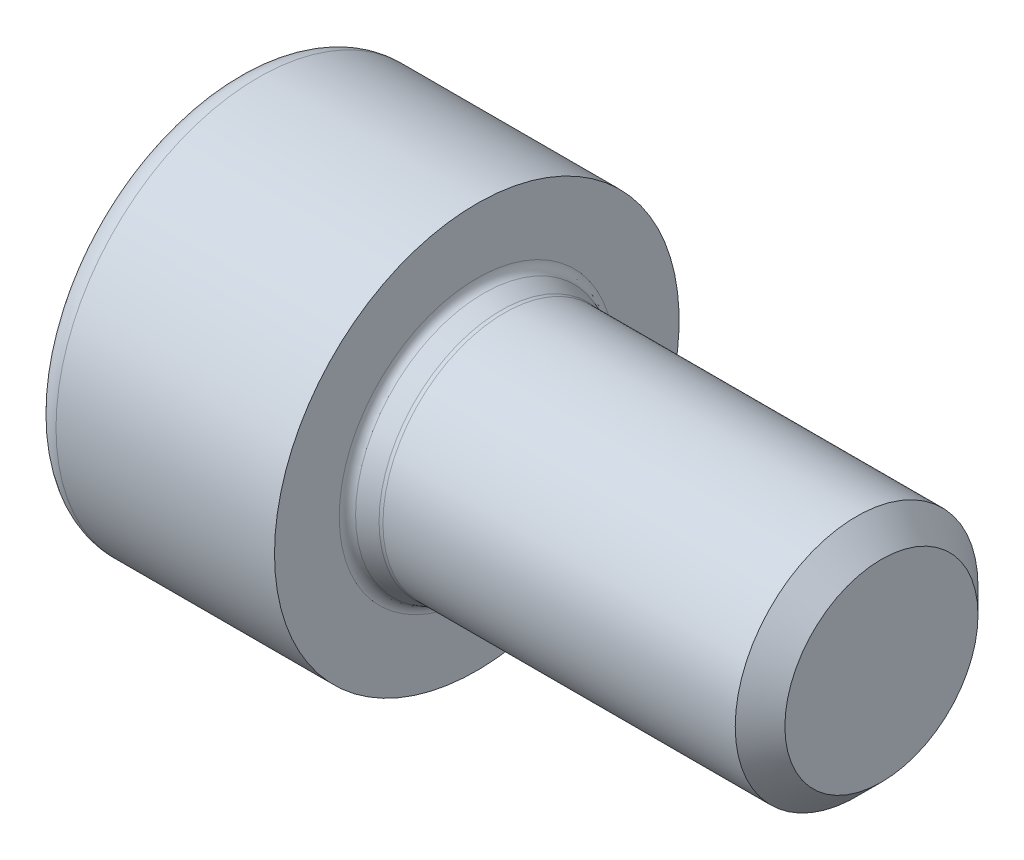
ISO-10303-21;
HEADER;
FILE_DESCRIPTION(('STEP AP214'),'2;1');
FILE_NAME('part.step','',(''),(''),'','','');
FILE_SCHEMA(('AUTOMOTIVE_DESIGN { 1 0 10303 214 1 1 1 1 }'));
ENDSEC;
DATA;
#1=APPLICATION_CONTEXT('core data for automotive mechanical design processes');
#2=APPLICATION_PROTOCOL_DEFINITION('international standard','automotive_design',2000,#1);
#3=PRODUCT_CONTEXT('',#1,'mechanical');
#4=PRODUCT('Part','Part','',(#3));
#5=PRODUCT_RELATED_PRODUCT_CATEGORY('part','',(#4));
#6=PRODUCT_DEFINITION_FORMATION('','',#4);
#7=PRODUCT_DEFINITION_CONTEXT('part definition',#1,'design');
#8=PRODUCT_DEFINITION('design','',#6,#7);
#9=PRODUCT_DEFINITION_SHAPE('','',#8);
#10=(LENGTH_UNIT() NAMED_UNIT(*) SI_UNIT(.MILLI.,.METRE.));
#11=(NAMED_UNIT(*) PLANE_ANGLE_UNIT() SI_UNIT($,.RADIAN.));
#12=(NAMED_UNIT(*) SI_UNIT($,.STERADIAN.) SOLID_ANGLE_UNIT());
#13=UNCERTAINTY_MEASURE_WITH_UNIT(LENGTH_MEASURE(1.E-05),#10,'distance_accuracy_value','');
#14=(GEOMETRIC_REPRESENTATION_CONTEXT(3) GLOBAL_UNCERTAINTY_ASSIGNED_CONTEXT((#13)) GLOBAL_UNIT_ASSIGNED_CONTEXT((#10,
#11,#12)) REPRESENTATION_CONTEXT('',''));
#15=CARTESIAN_POINT('',(0.,0.,0.));
#16=DIRECTION('',(0.,0.,1.));
#17=DIRECTION('',(1.,0.,0.));
#18=AXIS2_PLACEMENT_3D('',#15,#16,#17);
#19=CARTESIAN_POINT('',(-6.,2.5,0.));
#20=DIRECTION('',(1.,0.,0.));
#21=DIRECTION('',(0.,0.,-1.));
#22=AXIS2_PLACEMENT_3D('',#19,#20,#21);
#23=PLANE('',#22);
#24=DIRECTION('',(0.,0.5,-0.866025403784439));
#25=VECTOR('',#24,1.);
#26=CARTESIAN_POINT('',(-6.,-1.5400635094611,-2.33253175473055));
#27=LINE('',#26,#25);
#28=CARTESIAN_POINT('',(-6.,-2.88675134594813,0.));
#29=VERTEX_POINT('',#28);
#30=CARTESIAN_POINT('',(-6.,-1.44337567297406,-2.5));
#31=VERTEX_POINT('',#30);
#32=EDGE_CURVE('E250',#29,#31,#27,.T.);
#33=ORIENTED_EDGE('',*,*,#32,.T.);
#34=DIRECTION('',(0.,1.,0.));
#35=VECTOR('',#34,1.);
#36=CARTESIAN_POINT('',(-6.,2.5,-2.5));
#37=LINE('',#36,#35);
#38=CARTESIAN_POINT('',(-6.,1.44337567297406,-2.5));
#39=VERTEX_POINT('',#38);
#40=EDGE_CURVE('E52',#31,#39,#37,.T.);
#41=ORIENTED_EDGE('',*,*,#40,.T.);
#42=DIRECTION('',(0.,0.5,0.866025403784439));
#43=VECTOR('',#42,1.);
#44=CARTESIAN_POINT('',(-6.,2.7900635094611,-0.167468245269452));
#45=LINE('',#44,#43);
#46=CARTESIAN_POINT('',(-6.,2.88675134594813,0.));
#47=VERTEX_POINT('',#46);
#48=EDGE_CURVE('E100',#39,#47,#45,.T.);
#49=ORIENTED_EDGE('',*,*,#48,.T.);
#50=DIRECTION('',(0.,-0.5,0.866025403784439));
#51=VECTOR('',#50,1.);
#52=CARTESIAN_POINT('',(-6.,2.7900635094611,0.167468245269452));
#53=LINE('',#52,#51);
#54=CARTESIAN_POINT('',(-6.,1.44337567297406,2.5));
#55=VERTEX_POINT('',#54);
#56=EDGE_CURVE('E249',#47,#55,#53,.T.);
#57=ORIENTED_EDGE('',*,*,#56,.T.);
#58=DIRECTION('',(0.,-1.,0.));
#59=VECTOR('',#58,1.);
#60=CARTESIAN_POINT('',(-6.,2.5,2.5));
#61=LINE('',#60,#59);
#62=CARTESIAN_POINT('',(-6.,-1.44337567297406,2.5));
#63=VERTEX_POINT('',#62);
#64=EDGE_CURVE('E182',#55,#63,#61,.T.);
#65=ORIENTED_EDGE('',*,*,#64,.T.);
#66=DIRECTION('',(0.,-0.5,-0.866025403784439));
#67=VECTOR('',#66,1.);
#68=CARTESIAN_POINT('',(-6.,-1.5400635094611,2.33253175473055));
#69=LINE('',#68,#67);
#70=EDGE_CURVE('E241',#63,#29,#69,.T.);
#71=ORIENTED_EDGE('',*,*,#70,.T.);
#72=EDGE_LOOP('',(#33,#41,#49,#57,#65,#71));
#73=FACE_BOUND('',#72,.T.);
#74=CARTESIAN_POINT('',(-6.,0.,0.));
#75=DIRECTION('',(-1.,0.,0.));
#76=DIRECTION('',(0.,0.,1.));
#77=AXIS2_PLACEMENT_3D('',#74,#75,#76);
#78=CIRCLE('',#77,4.40000000000001);
#79=CARTESIAN_POINT('',(-6.,0.,4.40000000000001));
#80=VERTEX_POINT('',#79);
#81=EDGE_CURVE('E240',#80,#80,#78,.T.);
#82=ORIENTED_EDGE('',*,*,#81,.T.);
#83=EDGE_LOOP('',(#82));
#84=FACE_BOUND('',#83,.T.);
#85=ADVANCED_FACE('F90',(#73,#84),#23,.F.);
#86=CARTESIAN_POINT('',(-5.40000000000001,0.,0.));
#87=DIRECTION('',(-1.,0.,0.));
#88=DIRECTION('',(0.,0.,1.));
#89=AXIS2_PLACEMENT_3D('',#86,#87,#88);
#90=TOROIDAL_SURFACE('',#89,4.40000000000001,0.599999999999989);
#91=ORIENTED_EDGE('',*,*,#81,.F.);
#92=EDGE_LOOP('',(#91));
#93=FACE_BOUND('',#92,.T.);
#94=CARTESIAN_POINT('',(-5.4,0.,0.));
#95=DIRECTION('',(-1.,0.,0.));
#96=DIRECTION('',(0.,0.,1.));
#97=AXIS2_PLACEMENT_3D('',#94,#95,#96);
#98=CIRCLE('',#97,5.);
#99=CARTESIAN_POINT('',(-5.4,0.,5.));
#100=VERTEX_POINT('',#99);
#101=EDGE_CURVE('E233',#100,#100,#98,.T.);
#102=ORIENTED_EDGE('',*,*,#101,.T.);
#103=EDGE_LOOP('',(#102));
#104=FACE_BOUND('',#103,.T.);
#105=ADVANCED_FACE('F302',(#93,#104),#90,.T.);
#106=CARTESIAN_POINT('',(10.,0.,0.));
#107=DIRECTION('',(-1.,0.,0.));
#108=DIRECTION('',(0.,0.,1.));
#109=AXIS2_PLACEMENT_3D('',#106,#107,#108);
#110=CYLINDRICAL_SURFACE('',#109,5.);
#111=ORIENTED_EDGE('',*,*,#101,.F.);
#112=EDGE_LOOP('',(#111));
#113=FACE_BOUND('',#112,.T.);
#114=CARTESIAN_POINT('',(0.,0.,0.));
#115=DIRECTION('',(-1.,0.,0.));
#116=DIRECTION('',(0.,0.,1.));
#117=AXIS2_PLACEMENT_3D('',#114,#115,#116);
#118=CIRCLE('',#117,5.);
#119=CARTESIAN_POINT('',(0.,0.,5.));
#120=VERTEX_POINT('',#119);
#121=EDGE_CURVE('E234',#120,#120,#118,.T.);
#122=ORIENTED_EDGE('',*,*,#121,.T.);
#123=EDGE_LOOP('',(#122));
#124=FACE_BOUND('',#123,.T.);
#125=ADVANCED_FACE('F313',(#113,#124),#110,.T.);
#126=CARTESIAN_POINT('',(0.,5.,0.));
#127=DIRECTION('',(-1.,0.,0.));
#128=DIRECTION('',(0.,0.,1.));
#129=AXIS2_PLACEMENT_3D('',#126,#127,#128);
#130=PLANE('',#129);
#131=ORIENTED_EDGE('',*,*,#121,.F.);
#132=EDGE_LOOP('',(#131));
#133=FACE_BOUND('',#132,.T.);
#134=CARTESIAN_POINT('',(0.,0.,0.));
#135=DIRECTION('',(-1.,0.,0.));
#136=DIRECTION('',(0.,0.,1.));
#137=AXIS2_PLACEMENT_3D('',#134,#135,#136);
#138=CIRCLE('',#137,3.4);
#139=CARTESIAN_POINT('',(0.,0.,3.4));
#140=VERTEX_POINT('',#139);
#141=EDGE_CURVE('E229',#140,#140,#138,.T.);
#142=ORIENTED_EDGE('',*,*,#141,.T.);
#143=EDGE_LOOP('',(#142));
#144=FACE_BOUND('',#143,.T.);
#145=ADVANCED_FACE('F320',(#133,#144),#130,.F.);
#146=CARTESIAN_POINT('',(0.25,0.,0.));
#147=DIRECTION('',(-1.,0.,0.));
#148=DIRECTION('',(0.,0.,1.));
#149=AXIS2_PLACEMENT_3D('',#146,#147,#148);
#150=TOROIDAL_SURFACE('',#149,3.4,0.25);
#151=ORIENTED_EDGE('',*,*,#141,.F.);
#152=EDGE_LOOP('',(#151));
#153=FACE_BOUND('',#152,.T.);
#154=CARTESIAN_POINT('',(0.167656960920427,0.,0.));
#155=DIRECTION('',(-1.,0.,0.));
#156=DIRECTION('',(0.,0.,1.));
#157=AXIS2_PLACEMENT_3D('',#154,#155,#156);
#158=CIRCLE('',#157,3.16394995463856);
#159=CARTESIAN_POINT('',(0.167656960920427,0.,3.16394995463856));
#160=VERTEX_POINT('',#159);
#161=EDGE_CURVE('E223',#160,#160,#158,.T.);
#162=ORIENTED_EDGE('',*,*,#161,.T.);
#163=EDGE_LOOP('',(#162));
#164=FACE_BOUND('',#163,.T.);
#165=ADVANCED_FACE('F319',(#153,#164),#150,.F.);
#166=CARTESIAN_POINT('',(0.597656960920427,0.,0.));
#167=DIRECTION('',(-1.,0.,0.));
#168=DIRECTION('',(0.,0.,1.));
#169=AXIS2_PLACEMENT_3D('',#166,#167,#168);
#170=CONICAL_SURFACE('',#169,3.01394995463856,0.335638550327609);
#171=ORIENTED_EDGE('',*,*,#161,.F.);
#172=EDGE_LOOP('',(#171));
#173=FACE_BOUND('',#172,.T.);
#174=CARTESIAN_POINT('',(0.597656960920427,0.,0.));
#175=DIRECTION('',(-1.,0.,0.));
#176=DIRECTION('',(0.,0.,1.));
#177=AXIS2_PLACEMENT_3D('',#174,#175,#176);
#178=CIRCLE('',#177,3.01394995463856);
#179=CARTESIAN_POINT('',(0.597656960920427,0.,3.01394995463856));
#180=VERTEX_POINT('',#179);
#181=EDGE_CURVE('E225',#180,#180,#178,.T.);
#182=ORIENTED_EDGE('',*,*,#181,.T.);
#183=EDGE_LOOP('',(#182));
#184=FACE_BOUND('',#183,.T.);
#185=ADVANCED_FACE('F322',(#173,#184),#170,.T.);
#186=CARTESIAN_POINT('',(0.680000000000007,0.,0.));
#187=DIRECTION('',(-1.,0.,0.));
#188=DIRECTION('',(0.,0.,1.));
#189=AXIS2_PLACEMENT_3D('',#186,#187,#188);
#190=TOROIDAL_SURFACE('',#189,3.25000000000004,0.250000000000041);
#191=ORIENTED_EDGE('',*,*,#181,.F.);
#192=EDGE_LOOP('',(#191));
#193=FACE_BOUND('',#192,.T.);
#194=CARTESIAN_POINT('',(0.68,0.,0.));
#195=DIRECTION('',(-1.,0.,0.));
#196=DIRECTION('',(0.,0.,1.));
#197=AXIS2_PLACEMENT_3D('',#194,#195,#196);
#198=CIRCLE('',#197,3.);
#199=CARTESIAN_POINT('',(0.68,0.,3.));
#200=VERTEX_POINT('',#199);
#201=EDGE_CURVE('E218',#200,#200,#198,.T.);
#202=ORIENTED_EDGE('',*,*,#201,.T.);
#203=EDGE_LOOP('',(#202));
#204=FACE_BOUND('',#203,.T.);
#205=ADVANCED_FACE('F327',(#193,#204),#190,.F.);
#206=CARTESIAN_POINT('',(10.,0.,0.));
#207=DIRECTION('',(-1.,0.,0.));
#208=DIRECTION('',(0.,0.,1.));
#209=AXIS2_PLACEMENT_3D('',#206,#207,#208);
#210=CYLINDRICAL_SURFACE('',#209,3.);
#211=ORIENTED_EDGE('',*,*,#201,.F.);
#212=EDGE_LOOP('',(#211));
#213=FACE_BOUND('',#212,.T.);
#214=CARTESIAN_POINT('',(9.3865,0.,0.));
#215=DIRECTION('',(-1.,0.,0.));
#216=DIRECTION('',(0.,0.,1.));
#217=AXIS2_PLACEMENT_3D('',#214,#215,#216);
#218=CIRCLE('',#217,3.);
#219=CARTESIAN_POINT('',(9.3865,0.,3.));
#220=VERTEX_POINT('',#219);
#221=EDGE_CURVE('E216',#220,#220,#218,.T.);
#222=ORIENTED_EDGE('',*,*,#221,.T.);
#223=EDGE_LOOP('',(#222));
#224=FACE_BOUND('',#223,.T.);
#225=ADVANCED_FACE('F332',(#213,#224),#210,.T.);
#226=CARTESIAN_POINT('',(10.,0.,0.));
#227=DIRECTION('',(-1.,0.,0.));
#228=DIRECTION('',(0.,0.,1.));
#229=AXIS2_PLACEMENT_3D('',#226,#227,#228);
#230=CONICAL_SURFACE('',#229,2.3865,0.785398163397449);
#231=ORIENTED_EDGE('',*,*,#221,.F.);
#232=EDGE_LOOP('',(#231));
#233=FACE_BOUND('',#232,.T.);
#234=CARTESIAN_POINT('',(10.,0.,0.));
#235=DIRECTION('',(-1.,0.,0.));
#236=DIRECTION('',(0.,0.,1.));
#237=AXIS2_PLACEMENT_3D('',#234,#235,#236);
#238=CIRCLE('',#237,2.3865);
#239=CARTESIAN_POINT('',(10.,0.,2.3865));
#240=VERTEX_POINT('',#239);
#241=EDGE_CURVE('E206',#240,#240,#238,.T.);
#242=ORIENTED_EDGE('',*,*,#241,.T.);
#243=EDGE_LOOP('',(#242));
#244=FACE_BOUND('',#243,.T.);
#245=ADVANCED_FACE('F299',(#233,#244),#230,.T.);
#246=CARTESIAN_POINT('',(10.,2.3865,0.));
#247=DIRECTION('',(-1.,0.,0.));
#248=DIRECTION('',(0.,0.,1.));
#249=AXIS2_PLACEMENT_3D('',#246,#247,#248);
#250=PLANE('',#249);
#251=ORIENTED_EDGE('',*,*,#241,.F.);
#252=EDGE_LOOP('',(#251));
#253=FACE_BOUND('',#252,.T.);
#254=ADVANCED_FACE('F295',(#253),#250,.F.);
#255=CARTESIAN_POINT('',(-2.3,0.,0.));
#256=DIRECTION('',(1.,0.,0.));
#257=DIRECTION('',(0.,0.,-1.));
#258=AXIS2_PLACEMENT_3D('',#255,#256,#257);
#259=PLANE('',#258);
#260=DIRECTION('',(0.,1.,0.));
#261=VECTOR('',#260,1.);
#262=CARTESIAN_POINT('',(-2.3,-1.44337567297406,-2.5));
#263=LINE('',#262,#261);
#264=CARTESIAN_POINT('',(-2.3,-1.44337567297406,-2.5));
#265=VERTEX_POINT('',#264);
#266=CARTESIAN_POINT('',(-2.30000000000001,0.,-2.5));
#267=VERTEX_POINT('',#266);
#268=EDGE_CURVE('E102',#265,#267,#263,.T.);
#269=ORIENTED_EDGE('',*,*,#268,.F.);
#270=DIRECTION('',(0.,0.5,-0.866025403784439));
#271=VECTOR('',#270,1.);
#272=CARTESIAN_POINT('',(-2.3,-2.88675134594813,0.));
#273=LINE('',#272,#271);
#274=CARTESIAN_POINT('',(-2.3,-2.1650635094611,-1.25));
#275=VERTEX_POINT('',#274);
#276=EDGE_CURVE('E192',#275,#265,#273,.T.);
#277=ORIENTED_EDGE('',*,*,#276,.F.);
#278=CARTESIAN_POINT('',(-2.30000000000001,0.,0.));
#279=DIRECTION('',(-1.,0.,0.));
#280=DIRECTION('',(0.,0.,1.));
#281=AXIS2_PLACEMENT_3D('',#278,#279,#280);
#282=CIRCLE('',#281,2.5);
#283=EDGE_CURVE('E269',#267,#275,#282,.T.);
#284=ORIENTED_EDGE('',*,*,#283,.F.);
#285=EDGE_LOOP('',(#269,#277,#284));
#286=FACE_BOUND('',#285,.T.);
#287=ADVANCED_FACE('F287',(#286),#259,.F.);
#288=CARTESIAN_POINT('',(-2.3,-2.88675134594813,0.));
#289=VERTEX_POINT('',#288);
#290=EDGE_CURVE('E198',#289,#275,#273,.T.);
#291=ORIENTED_EDGE('',*,*,#290,.F.);
#292=DIRECTION('',(0.,-0.5,-0.866025403784439));
#293=VECTOR('',#292,1.);
#294=CARTESIAN_POINT('',(-2.3,-1.44337567297406,2.5));
#295=LINE('',#294,#293);
#296=CARTESIAN_POINT('',(-2.3,-2.1650635094611,1.25));
#297=VERTEX_POINT('',#296);
#298=EDGE_CURVE('E190',#297,#289,#295,.T.);
#299=ORIENTED_EDGE('',*,*,#298,.F.);
#300=EDGE_CURVE('E271',#275,#297,#282,.T.);
#301=ORIENTED_EDGE('',*,*,#300,.F.);
#302=EDGE_LOOP('',(#291,#299,#301));
#303=FACE_BOUND('',#302,.T.);
#304=ADVANCED_FACE('F276',(#303),#259,.F.);
#305=CARTESIAN_POINT('',(-2.3,-1.44337567297406,2.5));
#306=VERTEX_POINT('',#305);
#307=EDGE_CURVE('E194',#306,#297,#295,.T.);
#308=ORIENTED_EDGE('',*,*,#307,.F.);
#309=DIRECTION('',(0.,-1.,0.));
#310=VECTOR('',#309,1.);
#311=CARTESIAN_POINT('',(-2.3,1.44337567297406,2.5));
#312=LINE('',#311,#310);
#313=CARTESIAN_POINT('',(-2.3,0.,2.5));
#314=VERTEX_POINT('',#313);
#315=EDGE_CURVE('E189',#314,#306,#312,.T.);
#316=ORIENTED_EDGE('',*,*,#315,.F.);
#317=EDGE_CURVE('E238',#297,#314,#282,.T.);
#318=ORIENTED_EDGE('',*,*,#317,.F.);
#319=EDGE_LOOP('',(#308,#316,#318));
#320=FACE_BOUND('',#319,.T.);
#321=ADVANCED_FACE('F277',(#320),#259,.F.);
#322=CARTESIAN_POINT('',(-2.3,1.44337567297406,2.5));
#323=VERTEX_POINT('',#322);
#324=EDGE_CURVE('E180',#323,#314,#312,.T.);
#325=ORIENTED_EDGE('',*,*,#324,.F.);
#326=DIRECTION('',(0.,-0.5,0.866025403784439));
#327=VECTOR('',#326,1.);
#328=CARTESIAN_POINT('',(-2.3,2.88675134594813,0.));
#329=LINE('',#328,#327);
#330=CARTESIAN_POINT('',(-2.3,2.1650635094611,1.25));
#331=VERTEX_POINT('',#330);
#332=EDGE_CURVE('E164',#331,#323,#329,.T.);
#333=ORIENTED_EDGE('',*,*,#332,.F.);
#334=EDGE_CURVE('E183',#314,#331,#282,.T.);
#335=ORIENTED_EDGE('',*,*,#334,.F.);
#336=EDGE_LOOP('',(#325,#333,#335));
#337=FACE_BOUND('',#336,.T.);
#338=ADVANCED_FACE('F184',(#337),#259,.F.);
#339=CARTESIAN_POINT('',(-2.3,2.88675134594813,0.));
#340=VERTEX_POINT('',#339);
#341=EDGE_CURVE('E172',#340,#331,#329,.T.);
#342=ORIENTED_EDGE('',*,*,#341,.F.);
#343=DIRECTION('',(0.,0.5,0.866025403784439));
#344=VECTOR('',#343,1.);
#345=CARTESIAN_POINT('',(-2.3,1.44337567297406,-2.5));
#346=LINE('',#345,#344);
#347=CARTESIAN_POINT('',(-2.3,2.1650635094611,-1.25));
#348=VERTEX_POINT('',#347);
#349=EDGE_CURVE('E203',#348,#340,#346,.T.);
#350=ORIENTED_EDGE('',*,*,#349,.F.);
#351=EDGE_CURVE('E245',#331,#348,#282,.T.);
#352=ORIENTED_EDGE('',*,*,#351,.F.);
#353=EDGE_LOOP('',(#342,#350,#352));
#354=FACE_BOUND('',#353,.T.);
#355=ADVANCED_FACE('F305',(#354),#259,.F.);
#356=CARTESIAN_POINT('',(-2.3,1.44337567297406,-2.5));
#357=VERTEX_POINT('',#356);
#358=EDGE_CURVE('E185',#357,#348,#346,.T.);
#359=ORIENTED_EDGE('',*,*,#358,.F.);
#360=EDGE_CURVE('E200',#267,#357,#263,.T.);
#361=ORIENTED_EDGE('',*,*,#360,.F.);
#362=EDGE_CURVE('E262',#348,#267,#282,.T.);
#363=ORIENTED_EDGE('',*,*,#362,.F.);
#364=EDGE_LOOP('',(#359,#361,#363));
#365=FACE_BOUND('',#364,.T.);
#366=ADVANCED_FACE('F265',(#365),#259,.F.);
#367=CARTESIAN_POINT('',(-8.3,2.88675134594813,0.));
#368=DIRECTION('',(0.,0.866025403784439,0.5));
#369=DIRECTION('',(0.,-0.5,0.866025403784439));
#370=AXIS2_PLACEMENT_3D('',#367,#368,#369);
#371=PLANE('',#370);
#372=ORIENTED_EDGE('',*,*,#56,.F.);
#373=DIRECTION('',(1.,0.,0.));
#374=VECTOR('',#373,1.);
#375=CARTESIAN_POINT('',(-8.3,2.88675134594813,0.));
#376=LINE('',#375,#374);
#377=EDGE_CURVE('E204',#47,#340,#376,.T.);
#378=ORIENTED_EDGE('',*,*,#377,.T.);
#379=ORIENTED_EDGE('',*,*,#341,.T.);
#380=ORIENTED_EDGE('',*,*,#332,.T.);
#381=DIRECTION('',(1.,0.,0.));
#382=VECTOR('',#381,1.);
#383=CARTESIAN_POINT('',(-8.3,1.44337567297406,2.5));
#384=LINE('',#383,#382);
#385=EDGE_CURVE('E169',#55,#323,#384,.T.);
#386=ORIENTED_EDGE('',*,*,#385,.F.);
#387=EDGE_LOOP('',(#372,#378,#379,#380,#386));
#388=FACE_BOUND('',#387,.T.);
#389=ADVANCED_FACE('F170',(#388),#371,.F.);
#390=CARTESIAN_POINT('',(-8.3,1.44337567297406,-2.5));
#391=DIRECTION('',(0.,0.866025403784439,-0.5));
#392=DIRECTION('',(0.,0.5,0.866025403784439));
#393=AXIS2_PLACEMENT_3D('',#390,#391,#392);
#394=PLANE('',#393);
#395=ORIENTED_EDGE('',*,*,#48,.F.);
#396=DIRECTION('',(1.,0.,0.));
#397=VECTOR('',#396,1.);
#398=CARTESIAN_POINT('',(-8.3,1.44337567297406,-2.5));
#399=LINE('',#398,#397);
#400=EDGE_CURVE('E210',#39,#357,#399,.T.);
#401=ORIENTED_EDGE('',*,*,#400,.T.);
#402=ORIENTED_EDGE('',*,*,#358,.T.);
#403=ORIENTED_EDGE('',*,*,#349,.T.);
#404=ORIENTED_EDGE('',*,*,#377,.F.);
#405=EDGE_LOOP('',(#395,#401,#402,#403,#404));
#406=FACE_BOUND('',#405,.T.);
#407=ADVANCED_FACE('F258',(#406),#394,.F.);
#408=CARTESIAN_POINT('',(-8.3,-1.44337567297406,-2.5));
#409=DIRECTION('',(0.,0.,-1.));
#410=DIRECTION('',(-1.,0.,0.));
#411=AXIS2_PLACEMENT_3D('',#408,#409,#410);
#412=PLANE('',#411);
#413=ORIENTED_EDGE('',*,*,#40,.F.);
#414=DIRECTION('',(1.,0.,0.));
#415=VECTOR('',#414,1.);
#416=CARTESIAN_POINT('',(-8.3,-1.44337567297406,-2.5));
#417=LINE('',#416,#415);
#418=EDGE_CURVE('E207',#31,#265,#417,.T.);
#419=ORIENTED_EDGE('',*,*,#418,.T.);
#420=ORIENTED_EDGE('',*,*,#268,.T.);
#421=ORIENTED_EDGE('',*,*,#360,.T.);
#422=ORIENTED_EDGE('',*,*,#400,.F.);
#423=EDGE_LOOP('',(#413,#419,#420,#421,#422));
#424=FACE_BOUND('',#423,.T.);
#425=ADVANCED_FACE('F256',(#424),#412,.F.);
#426=CARTESIAN_POINT('',(-8.3,-2.88675134594813,0.));
#427=DIRECTION('',(0.,-0.866025403784439,-0.5));
#428=DIRECTION('',(0.,0.5,-0.866025403784439));
#429=AXIS2_PLACEMENT_3D('',#426,#427,#428);
#430=PLANE('',#429);
#431=ORIENTED_EDGE('',*,*,#32,.F.);
#432=DIRECTION('',(1.,0.,0.));
#433=VECTOR('',#432,1.);
#434=CARTESIAN_POINT('',(-8.3,-2.88675134594813,0.));
#435=LINE('',#434,#433);
#436=EDGE_CURVE('E211',#29,#289,#435,.T.);
#437=ORIENTED_EDGE('',*,*,#436,.T.);
#438=ORIENTED_EDGE('',*,*,#290,.T.);
#439=ORIENTED_EDGE('',*,*,#276,.T.);
#440=ORIENTED_EDGE('',*,*,#418,.F.);
#441=EDGE_LOOP('',(#431,#437,#438,#439,#440));
#442=FACE_BOUND('',#441,.T.);
#443=ADVANCED_FACE('F286',(#442),#430,.F.);
#444=CARTESIAN_POINT('',(-8.3,-1.44337567297406,2.5));
#445=DIRECTION('',(0.,-0.866025403784439,0.5));
#446=DIRECTION('',(0.,-0.5,-0.866025403784439));
#447=AXIS2_PLACEMENT_3D('',#444,#445,#446);
#448=PLANE('',#447);
#449=ORIENTED_EDGE('',*,*,#70,.F.);
#450=DIRECTION('',(1.,0.,0.));
#451=VECTOR('',#450,1.);
#452=CARTESIAN_POINT('',(-8.3,-1.44337567297406,2.5));
#453=LINE('',#452,#451);
#454=EDGE_CURVE('E115',#63,#306,#453,.T.);
#455=ORIENTED_EDGE('',*,*,#454,.T.);
#456=ORIENTED_EDGE('',*,*,#307,.T.);
#457=ORIENTED_EDGE('',*,*,#298,.T.);
#458=ORIENTED_EDGE('',*,*,#436,.F.);
#459=EDGE_LOOP('',(#449,#455,#456,#457,#458));
#460=FACE_BOUND('',#459,.T.);
#461=ADVANCED_FACE('F284',(#460),#448,.F.);
#462=CARTESIAN_POINT('',(-8.3,1.44337567297406,2.5));
#463=DIRECTION('',(0.,0.,1.));
#464=DIRECTION('',(1.,0.,0.));
#465=AXIS2_PLACEMENT_3D('',#462,#463,#464);
#466=PLANE('',#465);
#467=ORIENTED_EDGE('',*,*,#64,.F.);
#468=ORIENTED_EDGE('',*,*,#385,.T.);
#469=ORIENTED_EDGE('',*,*,#324,.T.);
#470=ORIENTED_EDGE('',*,*,#315,.T.);
#471=ORIENTED_EDGE('',*,*,#454,.F.);
#472=EDGE_LOOP('',(#467,#468,#469,#470,#471));
#473=FACE_BOUND('',#472,.T.);
#474=ADVANCED_FACE('F176',(#473),#466,.F.);
#475=CARTESIAN_POINT('',(-2.30000000000001,0.,0.));
#476=DIRECTION('',(-1.,0.,0.));
#477=DIRECTION('',(0.,0.,1.));
#478=AXIS2_PLACEMENT_3D('',#475,#476,#477);
#479=CONICAL_SURFACE('',#478,2.5,1.0471975511966);
#480=CARTESIAN_POINT('',(-0.856624327025939,0.,0.));
#481=VERTEX_POINT('',#480);
#482=VERTEX_LOOP('',#481);
#483=FACE_BOUND('',#482,.T.);
#484=ORIENTED_EDGE('',*,*,#334,.T.);
#485=ORIENTED_EDGE('',*,*,#351,.T.);
#486=ORIENTED_EDGE('',*,*,#362,.T.);
#487=ORIENTED_EDGE('',*,*,#283,.T.);
#488=ORIENTED_EDGE('',*,*,#300,.T.);
#489=ORIENTED_EDGE('',*,*,#317,.T.);
#490=EDGE_LOOP('',(#484,#485,#486,#487,#488,#489));
#491=FACE_BOUND('',#490,.T.);
#492=ADVANCED_FACE('F93',(#483,#491),#479,.F.);
#493=CLOSED_SHELL('',(#85,#105,#125,#145,#165,#185,#205,#225,#245,#254,#287,#304,#321,#338,#355,
#366,#389,#407,#425,#443,#461,#474,#492));
#494=MANIFOLD_SOLID_BREP('B6',#493);
#495=ADVANCED_BREP_SHAPE_REPRESENTATION('',(#18,#494),#14);
#496=SHAPE_DEFINITION_REPRESENTATION(#9,#495);
ENDSEC;
END-ISO-10303-21;
